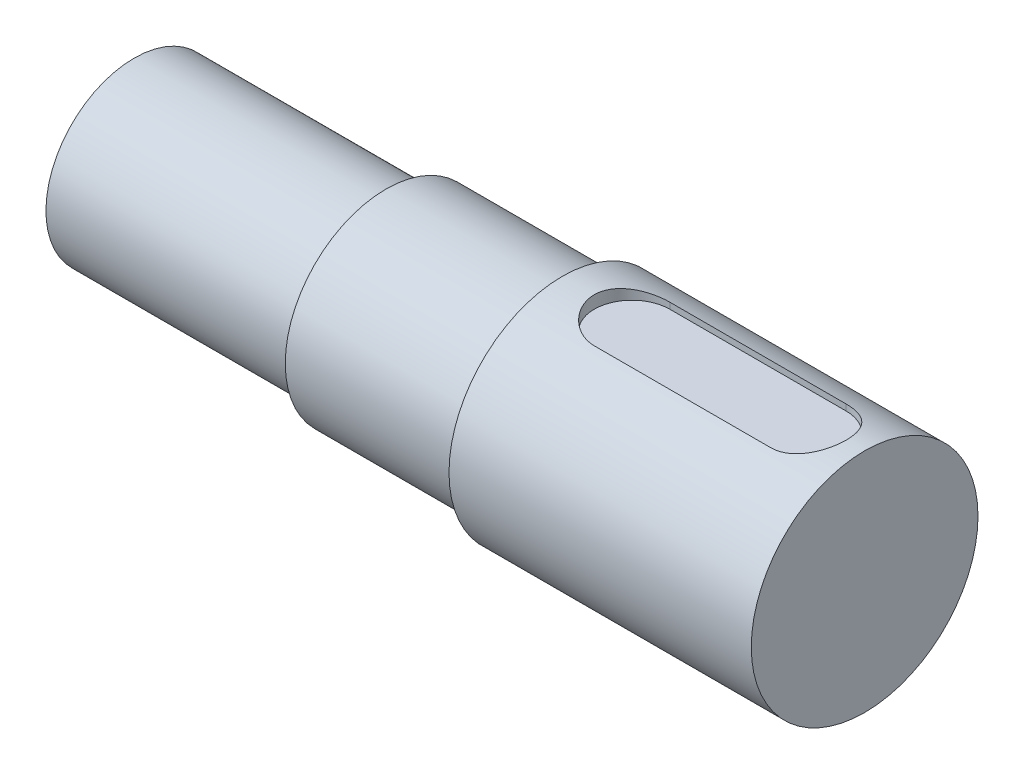
ISO-10303-21;
HEADER;
FILE_DESCRIPTION(('STEP AP214'),'2;1');
FILE_NAME('part.step','',(''),(''),'','','');
FILE_SCHEMA(('AUTOMOTIVE_DESIGN { 1 0 10303 214 1 1 1 1 }'));
ENDSEC;
DATA;
#1=APPLICATION_CONTEXT('core data for automotive mechanical design processes');
#2=APPLICATION_PROTOCOL_DEFINITION('international standard','automotive_design',2000,#1);
#3=PRODUCT_CONTEXT('',#1,'mechanical');
#4=PRODUCT('Part','Part','',(#3));
#5=PRODUCT_RELATED_PRODUCT_CATEGORY('part','',(#4));
#6=PRODUCT_DEFINITION_FORMATION('','',#4);
#7=PRODUCT_DEFINITION_CONTEXT('part definition',#1,'design');
#8=PRODUCT_DEFINITION('design','',#6,#7);
#9=PRODUCT_DEFINITION_SHAPE('','',#8);
#10=(LENGTH_UNIT() NAMED_UNIT(*) SI_UNIT(.MILLI.,.METRE.));
#11=(NAMED_UNIT(*) PLANE_ANGLE_UNIT() SI_UNIT($,.RADIAN.));
#12=(NAMED_UNIT(*) SI_UNIT($,.STERADIAN.) SOLID_ANGLE_UNIT());
#13=UNCERTAINTY_MEASURE_WITH_UNIT(LENGTH_MEASURE(1.E-05),#10,'distance_accuracy_value','');
#14=(GEOMETRIC_REPRESENTATION_CONTEXT(3) GLOBAL_UNCERTAINTY_ASSIGNED_CONTEXT((#13)) GLOBAL_UNIT_ASSIGNED_CONTEXT((#10,
#11,#12)) REPRESENTATION_CONTEXT('',''));
#15=CARTESIAN_POINT('',(0.,0.,0.));
#16=DIRECTION('',(0.,0.,1.));
#17=DIRECTION('',(1.,0.,0.));
#18=AXIS2_PLACEMENT_3D('',#15,#16,#17);
#19=CARTESIAN_POINT('',(29.,0.,0.));
#20=DIRECTION('',(1.,0.,0.));
#21=DIRECTION('',(0.,1.,0.));
#22=AXIS2_PLACEMENT_3D('',#19,#20,#21);
#23=CYLINDRICAL_SURFACE('',#22,4.5);
#24=CARTESIAN_POINT('',(17.,0.,0.));
#25=DIRECTION('',(1.,0.,0.));
#26=DIRECTION('',(0.,1.,0.));
#27=AXIS2_PLACEMENT_3D('',#24,#25,#26);
#28=CIRCLE('',#27,4.5);
#29=CARTESIAN_POINT('',(17.,4.5,0.));
#30=VERTEX_POINT('',#29);
#31=EDGE_CURVE('E129',#30,#30,#28,.T.);
#32=ORIENTED_EDGE('',*,*,#31,.T.);
#33=EDGE_LOOP('',(#32));
#34=FACE_BOUND('',#33,.T.);
#35=CARTESIAN_POINT('',(29.,0.,0.));
#36=DIRECTION('',(1.,0.,0.));
#37=DIRECTION('',(0.,1.,0.));
#38=AXIS2_PLACEMENT_3D('',#35,#36,#37);
#39=CIRCLE('',#38,4.5);
#40=CARTESIAN_POINT('',(29.,4.5,0.));
#41=VERTEX_POINT('',#40);
#42=EDGE_CURVE('E96',#41,#41,#39,.T.);
#43=ORIENTED_EDGE('',*,*,#42,.F.);
#44=EDGE_LOOP('',(#43));
#45=FACE_BOUND('',#44,.T.);
#46=DIRECTION('',(1.,0.,0.));
#47=VECTOR('',#46,1.);
#48=CARTESIAN_POINT('',(29.,4.24264068711928,1.5));
#49=LINE('',#48,#47);
#50=CARTESIAN_POINT('',(26.7666212401142,4.24264068711928,1.5));
#51=VERTEX_POINT('',#50);
#52=CARTESIAN_POINT('',(19.7666212401142,4.24264068711929,1.5));
#53=VERTEX_POINT('',#52);
#54=EDGE_CURVE('E58',#51,#53,#49,.F.);
#55=ORIENTED_EDGE('',*,*,#54,.T.);
#56=CARTESIAN_POINT('',(19.7666212401142,4.24264068711928,1.5));
#57=CARTESIAN_POINT('',(19.7256854949125,4.24263663141508,1.5000011211888));
#58=CARTESIAN_POINT('',(19.6847706468302,4.24323389914867,1.49832318688109));
#59=CARTESIAN_POINT('',(19.6032583640319,4.24558990933831,1.4916384105546));
#60=CARTESIAN_POINT('',(19.5626608466247,4.24734833826183,1.48663246715029));
#61=CARTESIAN_POINT('',(19.4420330253215,4.25428638336976,1.46671601284618));
#62=CARTESIAN_POINT('',(19.3628499707085,4.26112938749272,1.44690634954217));
#63=CARTESIAN_POINT('',(19.2091834514486,4.27842112048288,1.39493761774564));
#64=CARTESIAN_POINT('',(19.1346974198048,4.28886785929394,1.3627853639813));
#65=CARTESIAN_POINT('',(18.992111489106,4.31218180829191,1.28710984344731));
#66=CARTESIAN_POINT('',(18.9240155465132,4.32505050342162,1.2435795942341));
#67=CARTESIAN_POINT('',(18.7935408931274,4.35231720603071,1.14457709028452));
#68=CARTESIAN_POINT('',(18.7314489194203,4.36675316652463,1.08873747048306));
#69=CARTESIAN_POINT('',(18.6173122134267,4.39520773039466,0.967482664487223));
#70=CARTESIAN_POINT('',(18.5652692702303,4.40922625907779,0.902065776831803));
#71=CARTESIAN_POINT('',(18.4714019619079,4.43570824491341,0.761405468934394));
#72=CARTESIAN_POINT('',(18.4298797635108,4.44812156342781,0.685950134037744));
#73=CARTESIAN_POINT('',(18.3602328625833,4.46954412906987,0.528643874948789));
#74=CARTESIAN_POINT('',(18.3321040673836,4.47855441589964,0.44679491339013));
#75=CARTESIAN_POINT('',(18.2910176509772,4.49188606714384,0.282044018217056));
#76=CARTESIAN_POINT('',(18.2775663312837,4.4963596348286,0.199277751690168));
#77=CARTESIAN_POINT('',(18.2646467923258,4.50065412605725,0.0325484541835092));
#78=CARTESIAN_POINT('',(18.2651752412096,4.50047615821953,-0.0514142868680891));
#79=CARTESIAN_POINT('',(18.2798876647742,4.49559057952899,-0.214655767919089));
#80=CARTESIAN_POINT('',(18.2935351970534,4.49106091486895,-0.293989053938305));
#81=CARTESIAN_POINT('',(18.3332110381254,4.47820440751235,-0.449166096564984));
#82=CARTESIAN_POINT('',(18.3592400334236,4.46987735426596,-0.525009659424696));
#83=CARTESIAN_POINT('',(18.4232532945152,4.45013502406956,-0.672228934546444));
#84=CARTESIAN_POINT('',(18.4613903077977,4.43868056757469,-0.743532758480989));
#85=CARTESIAN_POINT('',(18.5484111672003,4.41387581520066,-0.878886883646233));
#86=CARTESIAN_POINT('',(18.597297936684,4.4005250039639,-0.942935204572028));
#87=CARTESIAN_POINT('',(18.7071278151095,4.37259407914109,-1.06514600956682));
#88=CARTESIAN_POINT('',(18.7685295555288,4.35798568019871,-1.12289041741905));
#89=CARTESIAN_POINT('',(18.9002834746885,4.32971235709277,-1.22740803723058));
#90=CARTESIAN_POINT('',(18.9706385337191,4.3160477387363,-1.27417770477572));
#91=CARTESIAN_POINT('',(19.1196415076442,4.29105047064476,-1.35600498838917));
#92=CARTESIAN_POINT('',(19.1983965125136,4.27975522422352,-1.39087951426152));
#93=CARTESIAN_POINT('',(19.3610917064992,4.26121645593058,-1.44669034605167));
#94=CARTESIAN_POINT('',(19.4450234801725,4.25396654113489,-1.46764865408303));
#95=CARTESIAN_POINT('',(19.5692491952362,4.2470481314208,-1.48748723442124));
#96=CARTESIAN_POINT('',(19.6085833248956,4.24540001541903,-1.49217759188267));
#97=CARTESIAN_POINT('',(19.6874783577139,4.24319555357098,-1.49843192410679));
#98=CARTESIAN_POINT('',(19.7270389019308,4.24263779894292,-1.49999993309247));
#99=CARTESIAN_POINT('',(19.7666212401142,4.24264068711928,-1.5));
#100=B_SPLINE_CURVE_WITH_KNOTS('',3,(#56,#57,#58,#59,#60,#61,#62,#63,#64,#65,#66,#67,#68,#69,
#70,#71,#72,#73,#74,#75,#76,#77,#78,#79,#80,#81,#82,#83,#84,#85,#86,#87,#88,#89,#90,#91,#92,#93,
#94,#95,#96,#97,#98,#99),.UNSPECIFIED.,.F.,.F.,(4,2,2,2,2,2,2,2,2,2,2,2,2,2,2,2,2,2,2,2,2,4),
(0.,0.122727727103154,0.2454223292542,0.48987179759306,0.734186491449354,0.978651469702964,
1.23174757444017,1.48488869795621,1.74463699399652,2.00430586681691,2.25494206091104,
2.50551852045963,2.74626627698603,2.98702738362372,3.23095528238952,3.47494959883153,
3.73041081087075,3.98595441373863,4.2452704489206,4.50417551230259,4.62299842999127,
4.74166772293584),.UNSPECIFIED.);
#101=CARTESIAN_POINT('',(19.7666212401142,4.24264068711928,-1.5));
#102=VERTEX_POINT('',#101);
#103=EDGE_CURVE('E11',#53,#102,#100,.T.);
#104=ORIENTED_EDGE('',*,*,#103,.T.);
#105=DIRECTION('',(1.,0.,0.));
#106=VECTOR('',#105,1.);
#107=CARTESIAN_POINT('',(29.,4.24264068711928,-1.5));
#108=LINE('',#107,#106);
#109=CARTESIAN_POINT('',(26.7666212401142,4.24264068711928,-1.5));
#110=VERTEX_POINT('',#109);
#111=EDGE_CURVE('E149',#102,#110,#108,.T.);
#112=ORIENTED_EDGE('',*,*,#111,.T.);
#113=CARTESIAN_POINT('',(26.7666212401142,4.24264068711928,-1.5));
#114=CARTESIAN_POINT('',(26.8075569853159,4.24263663141508,-1.5000011211888));
#115=CARTESIAN_POINT('',(26.8484718333982,4.24323389914867,-1.49832318688109));
#116=CARTESIAN_POINT('',(26.9299841161966,4.24558990933831,-1.4916384105546));
#117=CARTESIAN_POINT('',(26.9705816336038,4.24734833826183,-1.48663246715029));
#118=CARTESIAN_POINT('',(27.0912094549069,4.25428638336976,-1.46671601284618));
#119=CARTESIAN_POINT('',(27.1703925095199,4.26112938749272,-1.44690634954217));
#120=CARTESIAN_POINT('',(27.3240590287799,4.27842112048288,-1.39493761774564));
#121=CARTESIAN_POINT('',(27.3985450604236,4.28886785929394,-1.3627853639813));
#122=CARTESIAN_POINT('',(27.5411309911224,4.31218180829191,-1.2871098434473));
#123=CARTESIAN_POINT('',(27.6092269337152,4.32505050342162,-1.2435795942341));
#124=CARTESIAN_POINT('',(27.739701587101,4.35231720603071,-1.14457709028452));
#125=CARTESIAN_POINT('',(27.8017935608081,4.36675316652463,-1.08873747048306));
#126=CARTESIAN_POINT('',(27.9159302668018,4.39520773039467,-0.967482664487226));
#127=CARTESIAN_POINT('',(27.9679732099981,4.40922625907779,-0.902065776831806));
#128=CARTESIAN_POINT('',(28.0618405183205,4.43570824491341,-0.761405468934397));
#129=CARTESIAN_POINT('',(28.1033627167176,4.44812156342781,-0.685950134037746));
#130=CARTESIAN_POINT('',(28.1730096176451,4.46954412906987,-0.528643874948789));
#131=CARTESIAN_POINT('',(28.2011384128449,4.47855441589964,-0.446794913390129));
#132=CARTESIAN_POINT('',(28.2422248292513,4.49188606714384,-0.282044018217053));
#133=CARTESIAN_POINT('',(28.2556761489447,4.4963596348286,-0.199277751690166));
#134=CARTESIAN_POINT('',(28.2685956879026,4.50065412605725,-0.0325484541835082));
#135=CARTESIAN_POINT('',(28.2680672390188,4.50047615821953,0.0514142868680898));
#136=CARTESIAN_POINT('',(28.2533548154542,4.49559057952899,0.214655767919089));
#137=CARTESIAN_POINT('',(28.239707283175,4.49106091486895,0.293989053938306));
#138=CARTESIAN_POINT('',(28.200031442103,4.47820440751235,0.449166096564985));
#139=CARTESIAN_POINT('',(28.1740024468048,4.46987735426596,0.525009659424697));
#140=CARTESIAN_POINT('',(28.1099891857133,4.45013502406956,0.672228934546445));
#141=CARTESIAN_POINT('',(28.0718521724307,4.43868056757469,0.74353275848099));
#142=CARTESIAN_POINT('',(27.9848313130282,4.41387581520066,0.878886883646234));
#143=CARTESIAN_POINT('',(27.9359445435445,4.4005250039639,0.942935204572028));
#144=CARTESIAN_POINT('',(27.826114665119,4.37259407914109,1.06514600956682));
#145=CARTESIAN_POINT('',(27.7647129246997,4.35798568019871,1.12289041741905));
#146=CARTESIAN_POINT('',(27.63295900554,4.32971235709277,1.22740803723058));
#147=CARTESIAN_POINT('',(27.5626039465094,4.3160477387363,1.27417770477572));
#148=CARTESIAN_POINT('',(27.4136009725843,4.29105047064476,1.35600498838918));
#149=CARTESIAN_POINT('',(27.3348459677148,4.27975522422352,1.39087951426152));
#150=CARTESIAN_POINT('',(27.1721507737293,4.26121645593058,1.44669034605168));
#151=CARTESIAN_POINT('',(27.088219000056,4.25396654113489,1.46764865408303));
#152=CARTESIAN_POINT('',(26.9639932849922,4.2470481314208,1.48748723442124));
#153=CARTESIAN_POINT('',(26.9246591553329,4.24540001541903,1.49217759188267));
#154=CARTESIAN_POINT('',(26.8457641225145,4.24319555357098,1.4984319241068));
#155=CARTESIAN_POINT('',(26.8062035782976,4.24263779894292,1.49999993309247));
#156=CARTESIAN_POINT('',(26.7666212401142,4.24264068711928,1.5));
#157=B_SPLINE_CURVE_WITH_KNOTS('',3,(#113,#114,#115,#116,#117,#118,#119,#120,#121,#122,#123,
#124,#125,#126,#127,#128,#129,#130,#131,#132,#133,#134,#135,#136,#137,#138,#139,#140,#141,#142,
#143,#144,#145,#146,#147,#148,#149,#150,#151,#152,#153,#154,#155,#156),.UNSPECIFIED.,.F.,.F.,(4,
2,2,2,2,2,2,2,2,2,2,2,2,2,2,2,2,2,2,2,2,4),(0.,0.122727727103147,0.245422329254196,
0.48987179759306,0.734186491449354,0.978651469702964,1.23174757444016,1.48488869795621,
1.74463699399652,2.00430586681691,2.25494206091104,2.50551852045963,2.74626627698603,
2.98702738362372,3.23095528238952,3.47494959883153,3.73041081087075,3.98595441373863,
4.2452704489206,4.50417551230259,4.62299842999127,4.74166772293584),.UNSPECIFIED.);
#158=EDGE_CURVE('E153',#110,#51,#157,.T.);
#159=ORIENTED_EDGE('',*,*,#158,.T.);
#160=EDGE_LOOP('',(#55,#104,#112,#159));
#161=FACE_BOUND('',#160,.T.);
#162=ADVANCED_FACE('F43',(#34,#45,#161),#23,.T.);
#163=CARTESIAN_POINT('',(0.,0.,0.));
#164=DIRECTION('',(-1.,0.,0.));
#165=DIRECTION('',(0.,-1.,0.));
#166=AXIS2_PLACEMENT_3D('',#163,#164,#165);
#167=PLANE('',#166);
#168=CARTESIAN_POINT('',(0.,0.,0.));
#169=DIRECTION('',(1.,0.,0.));
#170=DIRECTION('',(0.,1.,0.));
#171=AXIS2_PLACEMENT_3D('',#168,#169,#170);
#172=CIRCLE('',#171,3.5);
#173=CARTESIAN_POINT('',(0.,3.5,0.));
#174=VERTEX_POINT('',#173);
#175=EDGE_CURVE('E145',#174,#174,#172,.T.);
#176=ORIENTED_EDGE('',*,*,#175,.F.);
#177=EDGE_LOOP('',(#176));
#178=FACE_BOUND('',#177,.T.);
#179=ADVANCED_FACE('F45',(#178),#167,.T.);
#180=CARTESIAN_POINT('',(29.,0.,0.));
#181=DIRECTION('',(1.,0.,0.));
#182=DIRECTION('',(0.,1.,0.));
#183=AXIS2_PLACEMENT_3D('',#180,#181,#182);
#184=CYLINDRICAL_SURFACE('',#183,3.5);
#185=ORIENTED_EDGE('',*,*,#175,.T.);
#186=EDGE_LOOP('',(#185));
#187=FACE_BOUND('',#186,.T.);
#188=CARTESIAN_POINT('',(10.,0.,0.));
#189=DIRECTION('',(1.,0.,0.));
#190=DIRECTION('',(0.,1.,0.));
#191=AXIS2_PLACEMENT_3D('',#188,#189,#190);
#192=CIRCLE('',#191,3.5);
#193=CARTESIAN_POINT('',(10.,3.5,0.));
#194=VERTEX_POINT('',#193);
#195=EDGE_CURVE('E141',#194,#194,#192,.T.);
#196=ORIENTED_EDGE('',*,*,#195,.F.);
#197=EDGE_LOOP('',(#196));
#198=FACE_BOUND('',#197,.T.);
#199=ADVANCED_FACE('F189',(#187,#198),#184,.T.);
#200=CARTESIAN_POINT('',(10.,3.5,0.));
#201=DIRECTION('',(-1.,0.,0.));
#202=DIRECTION('',(0.,-1.,0.));
#203=AXIS2_PLACEMENT_3D('',#200,#201,#202);
#204=PLANE('',#203);
#205=ORIENTED_EDGE('',*,*,#195,.T.);
#206=EDGE_LOOP('',(#205));
#207=FACE_BOUND('',#206,.T.);
#208=CARTESIAN_POINT('',(10.,0.,0.));
#209=DIRECTION('',(1.,0.,0.));
#210=DIRECTION('',(0.,1.,0.));
#211=AXIS2_PLACEMENT_3D('',#208,#209,#210);
#212=CIRCLE('',#211,4.);
#213=CARTESIAN_POINT('',(10.,4.,0.));
#214=VERTEX_POINT('',#213);
#215=EDGE_CURVE('E137',#214,#214,#212,.T.);
#216=ORIENTED_EDGE('',*,*,#215,.F.);
#217=EDGE_LOOP('',(#216));
#218=FACE_BOUND('',#217,.T.);
#219=ADVANCED_FACE('F254',(#207,#218),#204,.T.);
#220=CARTESIAN_POINT('',(29.,0.,0.));
#221=DIRECTION('',(1.,0.,0.));
#222=DIRECTION('',(0.,1.,0.));
#223=AXIS2_PLACEMENT_3D('',#220,#221,#222);
#224=CYLINDRICAL_SURFACE('',#223,4.);
#225=ORIENTED_EDGE('',*,*,#215,.T.);
#226=EDGE_LOOP('',(#225));
#227=FACE_BOUND('',#226,.T.);
#228=CARTESIAN_POINT('',(17.,0.,0.));
#229=DIRECTION('',(1.,0.,0.));
#230=DIRECTION('',(0.,1.,0.));
#231=AXIS2_PLACEMENT_3D('',#228,#229,#230);
#232=CIRCLE('',#231,4.);
#233=CARTESIAN_POINT('',(17.,4.,0.));
#234=VERTEX_POINT('',#233);
#235=EDGE_CURVE('E133',#234,#234,#232,.T.);
#236=ORIENTED_EDGE('',*,*,#235,.F.);
#237=EDGE_LOOP('',(#236));
#238=FACE_BOUND('',#237,.T.);
#239=ADVANCED_FACE('F182',(#227,#238),#224,.T.);
#240=CARTESIAN_POINT('',(17.,4.,0.));
#241=DIRECTION('',(-1.,0.,0.));
#242=DIRECTION('',(0.,-1.,0.));
#243=AXIS2_PLACEMENT_3D('',#240,#241,#242);
#244=PLANE('',#243);
#245=ORIENTED_EDGE('',*,*,#235,.T.);
#246=EDGE_LOOP('',(#245));
#247=FACE_BOUND('',#246,.T.);
#248=ORIENTED_EDGE('',*,*,#31,.F.);
#249=EDGE_LOOP('',(#248));
#250=FACE_BOUND('',#249,.T.);
#251=ADVANCED_FACE('F177',(#247,#250),#244,.T.);
#252=CARTESIAN_POINT('',(29.,4.5,0.));
#253=DIRECTION('',(1.,0.,0.));
#254=DIRECTION('',(0.,1.,0.));
#255=AXIS2_PLACEMENT_3D('',#252,#253,#254);
#256=PLANE('',#255);
#257=ORIENTED_EDGE('',*,*,#42,.T.);
#258=EDGE_LOOP('',(#257));
#259=FACE_BOUND('',#258,.T.);
#260=ADVANCED_FACE('F175',(#259),#256,.T.);
#261=CARTESIAN_POINT('',(19.7666212401142,14.,0.));
#262=DIRECTION('',(0.,-1.,0.));
#263=DIRECTION('',(0.,0.,-1.));
#264=AXIS2_PLACEMENT_3D('',#261,#262,#263);
#265=CYLINDRICAL_SURFACE('',#264,1.5);
#266=DIRECTION('',(0.,-1.,0.));
#267=VECTOR('',#266,1.);
#268=CARTESIAN_POINT('',(19.7666212401142,14.,1.5));
#269=LINE('',#268,#267);
#270=CARTESIAN_POINT('',(19.7666212401142,4.,1.5));
#271=VERTEX_POINT('',#270);
#272=EDGE_CURVE('E88',#53,#271,#269,.T.);
#273=ORIENTED_EDGE('',*,*,#272,.T.);
#274=CARTESIAN_POINT('',(19.7666212401142,4.,0.));
#275=DIRECTION('',(0.,1.,0.));
#276=DIRECTION('',(0.,0.,1.));
#277=AXIS2_PLACEMENT_3D('',#274,#275,#276);
#278=CIRCLE('',#277,1.5);
#279=CARTESIAN_POINT('',(19.7666212401142,4.,-1.5));
#280=VERTEX_POINT('',#279);
#281=EDGE_CURVE('E92',#280,#271,#278,.T.);
#282=ORIENTED_EDGE('',*,*,#281,.F.);
#283=DIRECTION('',(0.,-1.,0.));
#284=VECTOR('',#283,1.);
#285=CARTESIAN_POINT('',(19.7666212401142,14.,-1.5));
#286=LINE('',#285,#284);
#287=EDGE_CURVE('E119',#102,#280,#286,.T.);
#288=ORIENTED_EDGE('',*,*,#287,.F.);
#289=ORIENTED_EDGE('',*,*,#103,.F.);
#290=EDGE_LOOP('',(#273,#282,#288,#289));
#291=FACE_BOUND('',#290,.T.);
#292=ADVANCED_FACE('F90',(#291),#265,.F.);
#293=CARTESIAN_POINT('',(19.7666212401142,14.,1.5));
#294=DIRECTION('',(0.,0.,-1.));
#295=DIRECTION('',(-1.,0.,0.));
#296=AXIS2_PLACEMENT_3D('',#293,#294,#295);
#297=PLANE('',#296);
#298=DIRECTION('',(0.,-1.,0.));
#299=VECTOR('',#298,1.);
#300=CARTESIAN_POINT('',(26.7666212401142,14.,1.5));
#301=LINE('',#300,#299);
#302=CARTESIAN_POINT('',(26.7666212401142,4.,1.5));
#303=VERTEX_POINT('',#302);
#304=EDGE_CURVE('E97',#51,#303,#301,.T.);
#305=ORIENTED_EDGE('',*,*,#304,.T.);
#306=DIRECTION('',(1.,0.,0.));
#307=VECTOR('',#306,1.);
#308=CARTESIAN_POINT('',(19.7666212401142,4.,1.5));
#309=LINE('',#308,#307);
#310=EDGE_CURVE('E100',#271,#303,#309,.T.);
#311=ORIENTED_EDGE('',*,*,#310,.F.);
#312=ORIENTED_EDGE('',*,*,#272,.F.);
#313=ORIENTED_EDGE('',*,*,#54,.F.);
#314=EDGE_LOOP('',(#305,#311,#312,#313));
#315=FACE_BOUND('',#314,.T.);
#316=ADVANCED_FACE('F101',(#315),#297,.T.);
#317=CARTESIAN_POINT('',(26.7666212401142,14.,0.));
#318=DIRECTION('',(0.,-1.,0.));
#319=DIRECTION('',(0.,0.,-1.));
#320=AXIS2_PLACEMENT_3D('',#317,#318,#319);
#321=CYLINDRICAL_SURFACE('',#320,1.5);
#322=DIRECTION('',(0.,-1.,0.));
#323=VECTOR('',#322,1.);
#324=CARTESIAN_POINT('',(26.7666212401142,14.,-1.5));
#325=LINE('',#324,#323);
#326=CARTESIAN_POINT('',(26.7666212401142,4.,-1.5));
#327=VERTEX_POINT('',#326);
#328=EDGE_CURVE('E65',#110,#327,#325,.T.);
#329=ORIENTED_EDGE('',*,*,#328,.T.);
#330=CARTESIAN_POINT('',(26.7666212401142,4.,0.));
#331=DIRECTION('',(0.,1.,0.));
#332=DIRECTION('',(0.,0.,1.));
#333=AXIS2_PLACEMENT_3D('',#330,#331,#332);
#334=CIRCLE('',#333,1.5);
#335=EDGE_CURVE('E107',#303,#327,#334,.T.);
#336=ORIENTED_EDGE('',*,*,#335,.F.);
#337=ORIENTED_EDGE('',*,*,#304,.F.);
#338=ORIENTED_EDGE('',*,*,#158,.F.);
#339=EDGE_LOOP('',(#329,#336,#337,#338));
#340=FACE_BOUND('',#339,.T.);
#341=ADVANCED_FACE('F164',(#340),#321,.F.);
#342=CARTESIAN_POINT('',(19.7666212401142,14.,-1.5));
#343=DIRECTION('',(0.,0.,1.));
#344=DIRECTION('',(1.,0.,0.));
#345=AXIS2_PLACEMENT_3D('',#342,#343,#344);
#346=PLANE('',#345);
#347=ORIENTED_EDGE('',*,*,#287,.T.);
#348=DIRECTION('',(-1.,0.,0.));
#349=VECTOR('',#348,1.);
#350=CARTESIAN_POINT('',(19.7666212401142,4.,-1.5));
#351=LINE('',#350,#349);
#352=EDGE_CURVE('E111',#327,#280,#351,.T.);
#353=ORIENTED_EDGE('',*,*,#352,.F.);
#354=ORIENTED_EDGE('',*,*,#328,.F.);
#355=ORIENTED_EDGE('',*,*,#111,.F.);
#356=EDGE_LOOP('',(#347,#353,#354,#355));
#357=FACE_BOUND('',#356,.T.);
#358=ADVANCED_FACE('F169',(#357),#346,.T.);
#359=CARTESIAN_POINT('',(19.7666212401142,4.,0.));
#360=DIRECTION('',(0.,1.,0.));
#361=DIRECTION('',(0.,0.,1.));
#362=AXIS2_PLACEMENT_3D('',#359,#360,#361);
#363=PLANE('',#362);
#364=ORIENTED_EDGE('',*,*,#281,.T.);
#365=ORIENTED_EDGE('',*,*,#310,.T.);
#366=ORIENTED_EDGE('',*,*,#335,.T.);
#367=ORIENTED_EDGE('',*,*,#352,.T.);
#368=EDGE_LOOP('',(#364,#365,#366,#367));
#369=FACE_BOUND('',#368,.T.);
#370=ADVANCED_FACE('F110',(#369),#363,.T.);
#371=CLOSED_SHELL('',(#162,#179,#199,#219,#239,#251,#260,#292,#316,#341,#358,#370));
#372=MANIFOLD_SOLID_BREP('B2',#371);
#373=ADVANCED_BREP_SHAPE_REPRESENTATION('',(#18,#372),#14);
#374=SHAPE_DEFINITION_REPRESENTATION(#9,#373);
ENDSEC;
END-ISO-10303-21;
